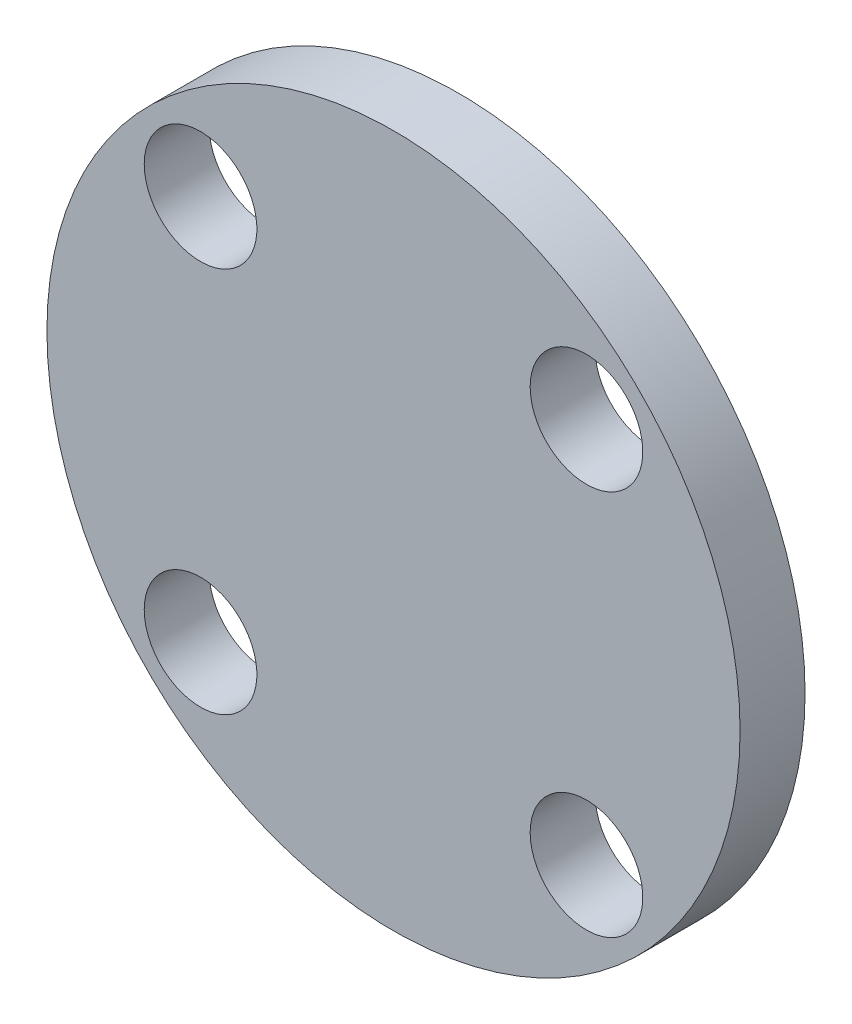
ISO-10303-21;
HEADER;
FILE_DESCRIPTION(('STEP AP214'),'2;1');
FILE_NAME('part.step','',(''),(''),'','','');
FILE_SCHEMA(('AUTOMOTIVE_DESIGN { 1 0 10303 214 1 1 1 1 }'));
ENDSEC;
DATA;
#1=APPLICATION_CONTEXT('core data for automotive mechanical design processes');
#2=APPLICATION_PROTOCOL_DEFINITION('international standard','automotive_design',2000,#1);
#3=PRODUCT_CONTEXT('',#1,'mechanical');
#4=PRODUCT('Part','Part','',(#3));
#5=PRODUCT_RELATED_PRODUCT_CATEGORY('part','',(#4));
#6=PRODUCT_DEFINITION_FORMATION('','',#4);
#7=PRODUCT_DEFINITION_CONTEXT('part definition',#1,'design');
#8=PRODUCT_DEFINITION('design','',#6,#7);
#9=PRODUCT_DEFINITION_SHAPE('','',#8);
#10=(LENGTH_UNIT() NAMED_UNIT(*) SI_UNIT(.MILLI.,.METRE.));
#11=(NAMED_UNIT(*) PLANE_ANGLE_UNIT() SI_UNIT($,.RADIAN.));
#12=(NAMED_UNIT(*) SI_UNIT($,.STERADIAN.) SOLID_ANGLE_UNIT());
#13=UNCERTAINTY_MEASURE_WITH_UNIT(LENGTH_MEASURE(1.E-05),#10,'distance_accuracy_value','');
#14=(GEOMETRIC_REPRESENTATION_CONTEXT(3) GLOBAL_UNCERTAINTY_ASSIGNED_CONTEXT((#13)) GLOBAL_UNIT_ASSIGNED_CONTEXT((#10,
#11,#12)) REPRESENTATION_CONTEXT('',''));
#15=CARTESIAN_POINT('',(0.,0.,0.));
#16=DIRECTION('',(0.,0.,1.));
#17=DIRECTION('',(1.,0.,0.));
#18=AXIS2_PLACEMENT_3D('',#15,#16,#17);
#19=CARTESIAN_POINT('',(0.,0.,9.525));
#20=DIRECTION('',(0.,0.,1.));
#21=DIRECTION('',(1.,0.,0.));
#22=AXIS2_PLACEMENT_3D('',#19,#20,#21);
#23=PLANE('',#22);
#24=CARTESIAN_POINT('',(28.28421467892,-28.2842146789189,9.525));
#25=DIRECTION('',(0.,0.,1.));
#26=DIRECTION('',(1.,0.,0.));
#27=AXIS2_PLACEMENT_3D('',#24,#25,#26);
#28=CIRCLE('',#27,8.255);
#29=CARTESIAN_POINT('',(20.02921467892,-28.2842146789189,9.525));
#30=VERTEX_POINT('',#29);
#31=EDGE_CURVE('E61',#30,#30,#28,.T.);
#32=ORIENTED_EDGE('',*,*,#31,.F.);
#33=EDGE_LOOP('',(#32));
#34=FACE_BOUND('',#33,.T.);
#35=CARTESIAN_POINT('',(-28.2842146789189,28.2842146789189,9.525));
#36=DIRECTION('',(0.,0.,1.));
#37=DIRECTION('',(1.,0.,0.));
#38=AXIS2_PLACEMENT_3D('',#35,#36,#37);
#39=CIRCLE('',#38,8.25499999999999);
#40=CARTESIAN_POINT('',(-36.5392146789189,28.2842146789189,9.525));
#41=VERTEX_POINT('',#40);
#42=EDGE_CURVE('E50',#41,#41,#39,.T.);
#43=ORIENTED_EDGE('',*,*,#42,.F.);
#44=EDGE_LOOP('',(#43));
#45=FACE_BOUND('',#44,.T.);
#46=CARTESIAN_POINT('',(0.,0.,9.525));
#47=DIRECTION('',(0.,0.,1.));
#48=DIRECTION('',(1.,0.,0.));
#49=AXIS2_PLACEMENT_3D('',#46,#47,#48);
#50=CIRCLE('',#49,50.8);
#51=CARTESIAN_POINT('',(-50.8,0.,9.525));
#52=VERTEX_POINT('',#51);
#53=EDGE_CURVE('E10',#52,#52,#50,.T.);
#54=ORIENTED_EDGE('',*,*,#53,.T.);
#55=EDGE_LOOP('',(#54));
#56=FACE_BOUND('',#55,.T.);
#57=CARTESIAN_POINT('',(28.2842146789189,28.2842146789189,9.525));
#58=DIRECTION('',(0.,0.,1.));
#59=DIRECTION('',(1.,0.,0.));
#60=AXIS2_PLACEMENT_3D('',#57,#58,#59);
#61=CIRCLE('',#60,8.25500000000001);
#62=CARTESIAN_POINT('',(20.0292146789189,28.2842146789189,9.525));
#63=VERTEX_POINT('',#62);
#64=EDGE_CURVE('E55',#63,#63,#61,.T.);
#65=ORIENTED_EDGE('',*,*,#64,.F.);
#66=EDGE_LOOP('',(#65));
#67=FACE_BOUND('',#66,.T.);
#68=CARTESIAN_POINT('',(-28.2842146789189,-28.284214678919,9.525));
#69=DIRECTION('',(0.,0.,1.));
#70=DIRECTION('',(1.,0.,0.));
#71=AXIS2_PLACEMENT_3D('',#68,#69,#70);
#72=CIRCLE('',#71,8.255);
#73=CARTESIAN_POINT('',(-36.5392146789189,-28.284214678919,9.525));
#74=VERTEX_POINT('',#73);
#75=EDGE_CURVE('E67',#74,#74,#72,.T.);
#76=ORIENTED_EDGE('',*,*,#75,.F.);
#77=EDGE_LOOP('',(#76));
#78=FACE_BOUND('',#77,.T.);
#79=ADVANCED_FACE('F39',(#34,#45,#56,#67,#78),#23,.T.);
#80=CARTESIAN_POINT('',(0.,0.,0.));
#81=DIRECTION('',(0.,0.,1.));
#82=DIRECTION('',(1.,0.,0.));
#83=AXIS2_PLACEMENT_3D('',#80,#81,#82);
#84=PLANE('',#83);
#85=CARTESIAN_POINT('',(0.,0.,0.));
#86=DIRECTION('',(0.,0.,1.));
#87=DIRECTION('',(1.,0.,0.));
#88=AXIS2_PLACEMENT_3D('',#85,#86,#87);
#89=CIRCLE('',#88,50.8);
#90=CARTESIAN_POINT('',(-50.8,0.,0.));
#91=VERTEX_POINT('',#90);
#92=EDGE_CURVE('E43',#91,#91,#89,.T.);
#93=ORIENTED_EDGE('',*,*,#92,.F.);
#94=EDGE_LOOP('',(#93));
#95=FACE_BOUND('',#94,.T.);
#96=CARTESIAN_POINT('',(-28.2842146789189,28.2842146789189,0.));
#97=DIRECTION('',(0.,0.,1.));
#98=DIRECTION('',(1.,0.,0.));
#99=AXIS2_PLACEMENT_3D('',#96,#97,#98);
#100=CIRCLE('',#99,8.25499999999999);
#101=CARTESIAN_POINT('',(-36.5392146789189,28.2842146789189,0.));
#102=VERTEX_POINT('',#101);
#103=EDGE_CURVE('E52',#102,#102,#100,.T.);
#104=ORIENTED_EDGE('',*,*,#103,.T.);
#105=EDGE_LOOP('',(#104));
#106=FACE_BOUND('',#105,.T.);
#107=CARTESIAN_POINT('',(28.2842146789189,28.2842146789189,0.));
#108=DIRECTION('',(0.,0.,1.));
#109=DIRECTION('',(1.,0.,0.));
#110=AXIS2_PLACEMENT_3D('',#107,#108,#109);
#111=CIRCLE('',#110,8.25500000000001);
#112=CARTESIAN_POINT('',(20.0292146789189,28.2842146789189,0.));
#113=VERTEX_POINT('',#112);
#114=EDGE_CURVE('E58',#113,#113,#111,.T.);
#115=ORIENTED_EDGE('',*,*,#114,.T.);
#116=EDGE_LOOP('',(#115));
#117=FACE_BOUND('',#116,.T.);
#118=CARTESIAN_POINT('',(28.28421467892,-28.2842146789189,0.));
#119=DIRECTION('',(0.,0.,1.));
#120=DIRECTION('',(1.,0.,0.));
#121=AXIS2_PLACEMENT_3D('',#118,#119,#120);
#122=CIRCLE('',#121,8.255);
#123=CARTESIAN_POINT('',(20.02921467892,-28.2842146789189,0.));
#124=VERTEX_POINT('',#123);
#125=EDGE_CURVE('E64',#124,#124,#122,.T.);
#126=ORIENTED_EDGE('',*,*,#125,.T.);
#127=EDGE_LOOP('',(#126));
#128=FACE_BOUND('',#127,.T.);
#129=CARTESIAN_POINT('',(-28.2842146789189,-28.284214678919,0.));
#130=DIRECTION('',(0.,0.,1.));
#131=DIRECTION('',(1.,0.,0.));
#132=AXIS2_PLACEMENT_3D('',#129,#130,#131);
#133=CIRCLE('',#132,8.255);
#134=CARTESIAN_POINT('',(-36.5392146789189,-28.284214678919,0.));
#135=VERTEX_POINT('',#134);
#136=EDGE_CURVE('E70',#135,#135,#133,.T.);
#137=ORIENTED_EDGE('',*,*,#136,.T.);
#138=EDGE_LOOP('',(#137));
#139=FACE_BOUND('',#138,.T.);
#140=ADVANCED_FACE('F80',(#95,#106,#117,#128,#139),#84,.F.);
#141=CARTESIAN_POINT('',(0.,0.,9.525));
#142=DIRECTION('',(0.,0.,-1.));
#143=DIRECTION('',(-1.,0.,0.));
#144=AXIS2_PLACEMENT_3D('',#141,#142,#143);
#145=CYLINDRICAL_SURFACE('',#144,50.8);
#146=CARTESIAN_POINT('',(-50.8,0.,9.525));
#147=CARTESIAN_POINT('',(-50.8,0.,9.42578125));
#148=CARTESIAN_POINT('',(-50.8,0.,9.3265625));
#149=CARTESIAN_POINT('',(-50.8,0.,9.128125));
#150=CARTESIAN_POINT('',(-50.8,0.,9.02890625));
#151=CARTESIAN_POINT('',(-50.8,0.,8.83046875));
#152=CARTESIAN_POINT('',(-50.8,0.,8.73125));
#153=CARTESIAN_POINT('',(-50.8,0.,8.5328125));
#154=CARTESIAN_POINT('',(-50.8,0.,8.43359375));
#155=CARTESIAN_POINT('',(-50.8,0.,8.23515625));
#156=CARTESIAN_POINT('',(-50.8,0.,8.1359375));
#157=CARTESIAN_POINT('',(-50.8,0.,7.9375));
#158=CARTESIAN_POINT('',(-50.8,0.,7.83828125));
#159=CARTESIAN_POINT('',(-50.8,0.,7.63984375));
#160=CARTESIAN_POINT('',(-50.8,0.,7.540625));
#161=CARTESIAN_POINT('',(-50.8,0.,7.3421875));
#162=CARTESIAN_POINT('',(-50.8,0.,7.24296875));
#163=CARTESIAN_POINT('',(-50.8,0.,7.04453125));
#164=CARTESIAN_POINT('',(-50.8,0.,6.9453125));
#165=CARTESIAN_POINT('',(-50.8,0.,6.746875));
#166=CARTESIAN_POINT('',(-50.8,0.,6.64765625));
#167=CARTESIAN_POINT('',(-50.8,0.,6.44921875));
#168=CARTESIAN_POINT('',(-50.8,0.,6.35));
#169=CARTESIAN_POINT('',(-50.8,0.,6.1515625));
#170=CARTESIAN_POINT('',(-50.8,0.,6.05234375));
#171=CARTESIAN_POINT('',(-50.8,0.,5.85390625));
#172=CARTESIAN_POINT('',(-50.8,0.,5.7546875));
#173=CARTESIAN_POINT('',(-50.8,0.,5.55625));
#174=CARTESIAN_POINT('',(-50.8,0.,5.45703125));
#175=CARTESIAN_POINT('',(-50.8,0.,5.25859375));
#176=CARTESIAN_POINT('',(-50.8,0.,5.159375));
#177=CARTESIAN_POINT('',(-50.8,0.,4.9609375));
#178=CARTESIAN_POINT('',(-50.8,0.,4.86171875));
#179=CARTESIAN_POINT('',(-50.8,0.,4.66328125));
#180=CARTESIAN_POINT('',(-50.8,0.,4.5640625));
#181=CARTESIAN_POINT('',(-50.8,0.,4.365625));
#182=CARTESIAN_POINT('',(-50.8,0.,4.26640625));
#183=CARTESIAN_POINT('',(-50.8,0.,4.06796875));
#184=CARTESIAN_POINT('',(-50.8,0.,3.96875));
#185=CARTESIAN_POINT('',(-50.8,0.,3.7703125));
#186=CARTESIAN_POINT('',(-50.8,0.,3.67109375));
#187=CARTESIAN_POINT('',(-50.8,0.,3.47265625));
#188=CARTESIAN_POINT('',(-50.8,0.,3.3734375));
#189=CARTESIAN_POINT('',(-50.8,0.,3.175));
#190=CARTESIAN_POINT('',(-50.8,0.,3.07578125));
#191=CARTESIAN_POINT('',(-50.8,0.,2.87734375));
#192=CARTESIAN_POINT('',(-50.8,0.,2.778125));
#193=CARTESIAN_POINT('',(-50.8,0.,2.5796875));
#194=CARTESIAN_POINT('',(-50.8,0.,2.48046875));
#195=CARTESIAN_POINT('',(-50.8,0.,2.28203125));
#196=CARTESIAN_POINT('',(-50.8,0.,2.1828125));
#197=CARTESIAN_POINT('',(-50.8,0.,1.984375));
#198=CARTESIAN_POINT('',(-50.8,0.,1.88515625));
#199=CARTESIAN_POINT('',(-50.8,0.,1.68671875));
#200=CARTESIAN_POINT('',(-50.8,0.,1.5875));
#201=CARTESIAN_POINT('',(-50.8,0.,1.3890625));
#202=CARTESIAN_POINT('',(-50.8,0.,1.28984375));
#203=CARTESIAN_POINT('',(-50.8,0.,1.09140625));
#204=CARTESIAN_POINT('',(-50.8,0.,0.992187500000001));
#205=CARTESIAN_POINT('',(-50.8,0.,0.793750000000001));
#206=CARTESIAN_POINT('',(-50.8,0.,0.69453125));
#207=CARTESIAN_POINT('',(-50.8,0.,0.49609375));
#208=CARTESIAN_POINT('',(-50.8,0.,0.396875));
#209=CARTESIAN_POINT('',(-50.8,0.,0.1984375));
#210=CARTESIAN_POINT('',(-50.8,0.,0.0992187500000001));
#211=CARTESIAN_POINT('',(-50.8,0.,0.));
#212=B_SPLINE_CURVE_WITH_KNOTS('',3,(#146,#147,#148,#149,#150,#151,#152,#153,#154,#155,#156,
#157,#158,#159,#160,#161,#162,#163,#164,#165,#166,#167,#168,#169,#170,#171,#172,#173,#174,#175,
#176,#177,#178,#179,#180,#181,#182,#183,#184,#185,#186,#187,#188,#189,#190,#191,#192,#193,#194,
#195,#196,#197,#198,#199,#200,#201,#202,#203,#204,#205,#206,#207,#208,#209,#210,#211),
.UNSPECIFIED.,.F.,.F.,(4,2,2,2,2,2,2,2,2,2,2,2,2,2,2,2,2,2,2,2,2,2,2,2,2,2,2,2,2,2,2,2,4),(0.,
0.297656249999998,0.595312499999999,0.892968749999999,1.190625,1.48828125,1.7859375,2.08359375,
2.38125,2.67890625,2.9765625,3.27421875,3.571875,3.86953125,4.1671875,4.46484375,4.7625,
5.06015625,5.3578125,5.65546875,5.953125,6.25078125,6.5484375,6.84609375,7.14375,7.44140625,
7.7390625,8.03671875,8.334375,8.63203125,8.9296875,9.22734375,9.525),.UNSPECIFIED.);
#213=EDGE_CURVE('BSEAM41',#52,#91,#212,.T.);
#214=ORIENTED_EDGE('',*,*,#53,.F.);
#215=ORIENTED_EDGE('',*,*,#92,.T.);
#216=ORIENTED_EDGE('',*,*,#213,.T.);
#217=ORIENTED_EDGE('',*,*,#213,.F.);
#218=EDGE_LOOP('',(#214,#216,#215,#217));
#219=FACE_BOUND('',#218,.T.);
#220=ADVANCED_FACE('F41',(#219),#145,.T.);
#221=CARTESIAN_POINT('',(-28.2842146789189,28.2842146789189,9.525));
#222=DIRECTION('',(0.,0.,-1.));
#223=DIRECTION('',(-1.,0.,0.));
#224=AXIS2_PLACEMENT_3D('',#221,#222,#223);
#225=CYLINDRICAL_SURFACE('',#224,8.25499999999999);
#226=CARTESIAN_POINT('',(-36.5392146789189,28.2842146789189,9.525));
#227=CARTESIAN_POINT('',(-36.5392146789189,28.2842146789189,9.42578125));
#228=CARTESIAN_POINT('',(-36.5392146789189,28.2842146789189,9.3265625));
#229=CARTESIAN_POINT('',(-36.5392146789189,28.2842146789189,9.128125));
#230=CARTESIAN_POINT('',(-36.5392146789189,28.2842146789189,9.02890625));
#231=CARTESIAN_POINT('',(-36.5392146789189,28.2842146789189,8.83046875));
#232=CARTESIAN_POINT('',(-36.5392146789189,28.2842146789189,8.73125));
#233=CARTESIAN_POINT('',(-36.5392146789189,28.2842146789189,8.5328125));
#234=CARTESIAN_POINT('',(-36.5392146789189,28.2842146789189,8.43359375));
#235=CARTESIAN_POINT('',(-36.5392146789189,28.2842146789189,8.23515625));
#236=CARTESIAN_POINT('',(-36.5392146789189,28.2842146789189,8.1359375));
#237=CARTESIAN_POINT('',(-36.5392146789189,28.2842146789189,7.9375));
#238=CARTESIAN_POINT('',(-36.5392146789189,28.2842146789189,7.83828125));
#239=CARTESIAN_POINT('',(-36.5392146789189,28.2842146789189,7.63984375));
#240=CARTESIAN_POINT('',(-36.5392146789189,28.2842146789189,7.540625));
#241=CARTESIAN_POINT('',(-36.5392146789189,28.2842146789189,7.3421875));
#242=CARTESIAN_POINT('',(-36.5392146789189,28.2842146789189,7.24296875));
#243=CARTESIAN_POINT('',(-36.5392146789189,28.2842146789189,7.04453125));
#244=CARTESIAN_POINT('',(-36.5392146789189,28.2842146789189,6.9453125));
#245=CARTESIAN_POINT('',(-36.5392146789189,28.2842146789189,6.746875));
#246=CARTESIAN_POINT('',(-36.5392146789189,28.2842146789189,6.64765625));
#247=CARTESIAN_POINT('',(-36.5392146789189,28.2842146789189,6.44921875));
#248=CARTESIAN_POINT('',(-36.5392146789189,28.2842146789189,6.35));
#249=CARTESIAN_POINT('',(-36.5392146789189,28.2842146789189,6.1515625));
#250=CARTESIAN_POINT('',(-36.5392146789189,28.2842146789189,6.05234375));
#251=CARTESIAN_POINT('',(-36.5392146789189,28.2842146789189,5.85390625));
#252=CARTESIAN_POINT('',(-36.5392146789189,28.2842146789189,5.7546875));
#253=CARTESIAN_POINT('',(-36.5392146789189,28.2842146789189,5.55625));
#254=CARTESIAN_POINT('',(-36.5392146789189,28.2842146789189,5.45703125));
#255=CARTESIAN_POINT('',(-36.5392146789189,28.2842146789189,5.25859375));
#256=CARTESIAN_POINT('',(-36.5392146789189,28.2842146789189,5.159375));
#257=CARTESIAN_POINT('',(-36.5392146789189,28.2842146789189,4.9609375));
#258=CARTESIAN_POINT('',(-36.5392146789189,28.2842146789189,4.86171875));
#259=CARTESIAN_POINT('',(-36.5392146789189,28.2842146789189,4.66328125));
#260=CARTESIAN_POINT('',(-36.5392146789189,28.2842146789189,4.5640625));
#261=CARTESIAN_POINT('',(-36.5392146789189,28.2842146789189,4.365625));
#262=CARTESIAN_POINT('',(-36.5392146789189,28.2842146789189,4.26640625));
#263=CARTESIAN_POINT('',(-36.5392146789189,28.2842146789189,4.06796875));
#264=CARTESIAN_POINT('',(-36.5392146789189,28.2842146789189,3.96875));
#265=CARTESIAN_POINT('',(-36.5392146789189,28.2842146789189,3.7703125));
#266=CARTESIAN_POINT('',(-36.5392146789189,28.2842146789189,3.67109375));
#267=CARTESIAN_POINT('',(-36.5392146789189,28.2842146789189,3.47265625));
#268=CARTESIAN_POINT('',(-36.5392146789189,28.2842146789189,3.3734375));
#269=CARTESIAN_POINT('',(-36.5392146789189,28.2842146789189,3.175));
#270=CARTESIAN_POINT('',(-36.5392146789189,28.2842146789189,3.07578125));
#271=CARTESIAN_POINT('',(-36.5392146789189,28.2842146789189,2.87734375));
#272=CARTESIAN_POINT('',(-36.5392146789189,28.2842146789189,2.778125));
#273=CARTESIAN_POINT('',(-36.5392146789189,28.2842146789189,2.5796875));
#274=CARTESIAN_POINT('',(-36.5392146789189,28.2842146789189,2.48046875));
#275=CARTESIAN_POINT('',(-36.5392146789189,28.2842146789189,2.28203125));
#276=CARTESIAN_POINT('',(-36.5392146789189,28.2842146789189,2.1828125));
#277=CARTESIAN_POINT('',(-36.5392146789189,28.2842146789189,1.984375));
#278=CARTESIAN_POINT('',(-36.5392146789189,28.2842146789189,1.88515625));
#279=CARTESIAN_POINT('',(-36.5392146789189,28.2842146789189,1.68671875));
#280=CARTESIAN_POINT('',(-36.5392146789189,28.2842146789189,1.5875));
#281=CARTESIAN_POINT('',(-36.5392146789189,28.2842146789189,1.3890625));
#282=CARTESIAN_POINT('',(-36.5392146789189,28.2842146789189,1.28984375));
#283=CARTESIAN_POINT('',(-36.5392146789189,28.2842146789189,1.09140625));
#284=CARTESIAN_POINT('',(-36.5392146789189,28.2842146789189,0.992187500000001));
#285=CARTESIAN_POINT('',(-36.5392146789189,28.2842146789189,0.793750000000001));
#286=CARTESIAN_POINT('',(-36.5392146789189,28.2842146789189,0.69453125));
#287=CARTESIAN_POINT('',(-36.5392146789189,28.2842146789189,0.49609375));
#288=CARTESIAN_POINT('',(-36.5392146789189,28.2842146789189,0.396875));
#289=CARTESIAN_POINT('',(-36.5392146789189,28.2842146789189,0.1984375));
#290=CARTESIAN_POINT('',(-36.5392146789189,28.2842146789189,0.0992187500000001));
#291=CARTESIAN_POINT('',(-36.5392146789189,28.2842146789189,0.));
#292=B_SPLINE_CURVE_WITH_KNOTS('',3,(#226,#227,#228,#229,#230,#231,#232,#233,#234,#235,#236,
#237,#238,#239,#240,#241,#242,#243,#244,#245,#246,#247,#248,#249,#250,#251,#252,#253,#254,#255,
#256,#257,#258,#259,#260,#261,#262,#263,#264,#265,#266,#267,#268,#269,#270,#271,#272,#273,#274,
#275,#276,#277,#278,#279,#280,#281,#282,#283,#284,#285,#286,#287,#288,#289,#290,#291),
.UNSPECIFIED.,.F.,.F.,(4,2,2,2,2,2,2,2,2,2,2,2,2,2,2,2,2,2,2,2,2,2,2,2,2,2,2,2,2,2,2,2,4),(0.,
0.297656249999998,0.595312499999999,0.892968749999999,1.190625,1.48828125,1.7859375,2.08359375,
2.38125,2.67890625,2.9765625,3.27421875,3.571875,3.86953125,4.1671875,4.46484375,4.7625,
5.06015625,5.3578125,5.65546875,5.953125,6.25078125,6.5484375,6.84609375,7.14375,7.44140625,
7.7390625,8.03671875,8.334375,8.63203125,8.9296875,9.22734375,9.525),.UNSPECIFIED.);
#293=EDGE_CURVE('BSEAM90',#41,#102,#292,.T.);
#294=ORIENTED_EDGE('',*,*,#42,.T.);
#295=ORIENTED_EDGE('',*,*,#103,.F.);
#296=ORIENTED_EDGE('',*,*,#293,.T.);
#297=ORIENTED_EDGE('',*,*,#293,.F.);
#298=EDGE_LOOP('',(#294,#296,#295,#297));
#299=FACE_BOUND('',#298,.T.);
#300=ADVANCED_FACE('F90',(#299),#225,.F.);
#301=CARTESIAN_POINT('',(28.2842146789189,28.2842146789189,9.525));
#302=DIRECTION('',(0.,0.,-1.));
#303=DIRECTION('',(-1.,0.,0.));
#304=AXIS2_PLACEMENT_3D('',#301,#302,#303);
#305=CYLINDRICAL_SURFACE('',#304,8.25500000000001);
#306=CARTESIAN_POINT('',(20.0292146789189,28.2842146789189,9.525));
#307=CARTESIAN_POINT('',(20.0292146789189,28.2842146789189,9.42578125));
#308=CARTESIAN_POINT('',(20.0292146789189,28.2842146789189,9.3265625));
#309=CARTESIAN_POINT('',(20.0292146789189,28.2842146789189,9.128125));
#310=CARTESIAN_POINT('',(20.0292146789189,28.2842146789189,9.02890625));
#311=CARTESIAN_POINT('',(20.0292146789189,28.2842146789189,8.83046875));
#312=CARTESIAN_POINT('',(20.0292146789189,28.2842146789189,8.73125));
#313=CARTESIAN_POINT('',(20.0292146789189,28.2842146789189,8.5328125));
#314=CARTESIAN_POINT('',(20.0292146789189,28.2842146789189,8.43359375));
#315=CARTESIAN_POINT('',(20.0292146789189,28.2842146789189,8.23515625));
#316=CARTESIAN_POINT('',(20.0292146789189,28.2842146789189,8.1359375));
#317=CARTESIAN_POINT('',(20.0292146789189,28.2842146789189,7.9375));
#318=CARTESIAN_POINT('',(20.0292146789189,28.2842146789189,7.83828125));
#319=CARTESIAN_POINT('',(20.0292146789189,28.2842146789189,7.63984375));
#320=CARTESIAN_POINT('',(20.0292146789189,28.2842146789189,7.540625));
#321=CARTESIAN_POINT('',(20.0292146789189,28.2842146789189,7.3421875));
#322=CARTESIAN_POINT('',(20.0292146789189,28.2842146789189,7.24296875));
#323=CARTESIAN_POINT('',(20.0292146789189,28.2842146789189,7.04453125));
#324=CARTESIAN_POINT('',(20.0292146789189,28.2842146789189,6.9453125));
#325=CARTESIAN_POINT('',(20.0292146789189,28.2842146789189,6.746875));
#326=CARTESIAN_POINT('',(20.0292146789189,28.2842146789189,6.64765625));
#327=CARTESIAN_POINT('',(20.0292146789189,28.2842146789189,6.44921875));
#328=CARTESIAN_POINT('',(20.0292146789189,28.2842146789189,6.35));
#329=CARTESIAN_POINT('',(20.0292146789189,28.2842146789189,6.1515625));
#330=CARTESIAN_POINT('',(20.0292146789189,28.2842146789189,6.05234375));
#331=CARTESIAN_POINT('',(20.0292146789189,28.2842146789189,5.85390625));
#332=CARTESIAN_POINT('',(20.0292146789189,28.2842146789189,5.7546875));
#333=CARTESIAN_POINT('',(20.0292146789189,28.2842146789189,5.55625));
#334=CARTESIAN_POINT('',(20.0292146789189,28.2842146789189,5.45703125));
#335=CARTESIAN_POINT('',(20.0292146789189,28.2842146789189,5.25859375));
#336=CARTESIAN_POINT('',(20.0292146789189,28.2842146789189,5.159375));
#337=CARTESIAN_POINT('',(20.0292146789189,28.2842146789189,4.9609375));
#338=CARTESIAN_POINT('',(20.0292146789189,28.2842146789189,4.86171875));
#339=CARTESIAN_POINT('',(20.0292146789189,28.2842146789189,4.66328125));
#340=CARTESIAN_POINT('',(20.0292146789189,28.2842146789189,4.5640625));
#341=CARTESIAN_POINT('',(20.0292146789189,28.2842146789189,4.365625));
#342=CARTESIAN_POINT('',(20.0292146789189,28.2842146789189,4.26640625));
#343=CARTESIAN_POINT('',(20.0292146789189,28.2842146789189,4.06796875));
#344=CARTESIAN_POINT('',(20.0292146789189,28.2842146789189,3.96875));
#345=CARTESIAN_POINT('',(20.0292146789189,28.2842146789189,3.7703125));
#346=CARTESIAN_POINT('',(20.0292146789189,28.2842146789189,3.67109375));
#347=CARTESIAN_POINT('',(20.0292146789189,28.2842146789189,3.47265625));
#348=CARTESIAN_POINT('',(20.0292146789189,28.2842146789189,3.3734375));
#349=CARTESIAN_POINT('',(20.0292146789189,28.2842146789189,3.175));
#350=CARTESIAN_POINT('',(20.0292146789189,28.2842146789189,3.07578125));
#351=CARTESIAN_POINT('',(20.0292146789189,28.2842146789189,2.87734375));
#352=CARTESIAN_POINT('',(20.0292146789189,28.2842146789189,2.778125));
#353=CARTESIAN_POINT('',(20.0292146789189,28.2842146789189,2.5796875));
#354=CARTESIAN_POINT('',(20.0292146789189,28.2842146789189,2.48046875));
#355=CARTESIAN_POINT('',(20.0292146789189,28.2842146789189,2.28203125));
#356=CARTESIAN_POINT('',(20.0292146789189,28.2842146789189,2.1828125));
#357=CARTESIAN_POINT('',(20.0292146789189,28.2842146789189,1.984375));
#358=CARTESIAN_POINT('',(20.0292146789189,28.2842146789189,1.88515625));
#359=CARTESIAN_POINT('',(20.0292146789189,28.2842146789189,1.68671875));
#360=CARTESIAN_POINT('',(20.0292146789189,28.2842146789189,1.5875));
#361=CARTESIAN_POINT('',(20.0292146789189,28.2842146789189,1.3890625));
#362=CARTESIAN_POINT('',(20.0292146789189,28.2842146789189,1.28984375));
#363=CARTESIAN_POINT('',(20.0292146789189,28.2842146789189,1.09140625));
#364=CARTESIAN_POINT('',(20.0292146789189,28.2842146789189,0.992187500000001));
#365=CARTESIAN_POINT('',(20.0292146789189,28.2842146789189,0.793750000000001));
#366=CARTESIAN_POINT('',(20.0292146789189,28.2842146789189,0.69453125));
#367=CARTESIAN_POINT('',(20.0292146789189,28.2842146789189,0.49609375));
#368=CARTESIAN_POINT('',(20.0292146789189,28.2842146789189,0.396875));
#369=CARTESIAN_POINT('',(20.0292146789189,28.2842146789189,0.1984375));
#370=CARTESIAN_POINT('',(20.0292146789189,28.2842146789189,0.0992187500000001));
#371=CARTESIAN_POINT('',(20.0292146789189,28.2842146789189,0.));
#372=B_SPLINE_CURVE_WITH_KNOTS('',3,(#306,#307,#308,#309,#310,#311,#312,#313,#314,#315,#316,
#317,#318,#319,#320,#321,#322,#323,#324,#325,#326,#327,#328,#329,#330,#331,#332,#333,#334,#335,
#336,#337,#338,#339,#340,#341,#342,#343,#344,#345,#346,#347,#348,#349,#350,#351,#352,#353,#354,
#355,#356,#357,#358,#359,#360,#361,#362,#363,#364,#365,#366,#367,#368,#369,#370,#371),
.UNSPECIFIED.,.F.,.F.,(4,2,2,2,2,2,2,2,2,2,2,2,2,2,2,2,2,2,2,2,2,2,2,2,2,2,2,2,2,2,2,2,4),(0.,
0.297656249999998,0.595312499999999,0.892968749999999,1.190625,1.48828125,1.7859375,2.08359375,
2.38125,2.67890625,2.9765625,3.27421875,3.571875,3.86953125,4.1671875,4.46484375,4.7625,
5.06015625,5.3578125,5.65546875,5.953125,6.25078125,6.5484375,6.84609375,7.14375,7.44140625,
7.7390625,8.03671875,8.334375,8.63203125,8.9296875,9.22734375,9.525),.UNSPECIFIED.);
#373=EDGE_CURVE('BSEAM93',#63,#113,#372,.T.);
#374=ORIENTED_EDGE('',*,*,#64,.T.);
#375=ORIENTED_EDGE('',*,*,#114,.F.);
#376=ORIENTED_EDGE('',*,*,#373,.T.);
#377=ORIENTED_EDGE('',*,*,#373,.F.);
#378=EDGE_LOOP('',(#374,#376,#375,#377));
#379=FACE_BOUND('',#378,.T.);
#380=ADVANCED_FACE('F93',(#379),#305,.F.);
#381=CARTESIAN_POINT('',(28.28421467892,-28.2842146789189,9.525));
#382=DIRECTION('',(0.,0.,-1.));
#383=DIRECTION('',(-1.,0.,0.));
#384=AXIS2_PLACEMENT_3D('',#381,#382,#383);
#385=CYLINDRICAL_SURFACE('',#384,8.255);
#386=CARTESIAN_POINT('',(20.02921467892,-28.2842146789189,9.525));
#387=CARTESIAN_POINT('',(20.02921467892,-28.2842146789189,9.42578125));
#388=CARTESIAN_POINT('',(20.02921467892,-28.2842146789189,9.3265625));
#389=CARTESIAN_POINT('',(20.02921467892,-28.2842146789189,9.128125));
#390=CARTESIAN_POINT('',(20.02921467892,-28.2842146789189,9.02890625));
#391=CARTESIAN_POINT('',(20.02921467892,-28.2842146789189,8.83046875));
#392=CARTESIAN_POINT('',(20.02921467892,-28.2842146789189,8.73125));
#393=CARTESIAN_POINT('',(20.02921467892,-28.2842146789189,8.5328125));
#394=CARTESIAN_POINT('',(20.02921467892,-28.2842146789189,8.43359375));
#395=CARTESIAN_POINT('',(20.02921467892,-28.2842146789189,8.23515625));
#396=CARTESIAN_POINT('',(20.02921467892,-28.2842146789189,8.1359375));
#397=CARTESIAN_POINT('',(20.02921467892,-28.2842146789189,7.9375));
#398=CARTESIAN_POINT('',(20.02921467892,-28.2842146789189,7.83828125));
#399=CARTESIAN_POINT('',(20.02921467892,-28.2842146789189,7.63984375));
#400=CARTESIAN_POINT('',(20.02921467892,-28.2842146789189,7.540625));
#401=CARTESIAN_POINT('',(20.02921467892,-28.2842146789189,7.3421875));
#402=CARTESIAN_POINT('',(20.02921467892,-28.2842146789189,7.24296875));
#403=CARTESIAN_POINT('',(20.02921467892,-28.2842146789189,7.04453125));
#404=CARTESIAN_POINT('',(20.02921467892,-28.2842146789189,6.9453125));
#405=CARTESIAN_POINT('',(20.02921467892,-28.2842146789189,6.746875));
#406=CARTESIAN_POINT('',(20.02921467892,-28.2842146789189,6.64765625));
#407=CARTESIAN_POINT('',(20.02921467892,-28.2842146789189,6.44921875));
#408=CARTESIAN_POINT('',(20.02921467892,-28.2842146789189,6.35));
#409=CARTESIAN_POINT('',(20.02921467892,-28.2842146789189,6.1515625));
#410=CARTESIAN_POINT('',(20.02921467892,-28.2842146789189,6.05234375));
#411=CARTESIAN_POINT('',(20.02921467892,-28.2842146789189,5.85390625));
#412=CARTESIAN_POINT('',(20.02921467892,-28.2842146789189,5.7546875));
#413=CARTESIAN_POINT('',(20.02921467892,-28.2842146789189,5.55625));
#414=CARTESIAN_POINT('',(20.02921467892,-28.2842146789189,5.45703125));
#415=CARTESIAN_POINT('',(20.02921467892,-28.2842146789189,5.25859375));
#416=CARTESIAN_POINT('',(20.02921467892,-28.2842146789189,5.159375));
#417=CARTESIAN_POINT('',(20.02921467892,-28.2842146789189,4.9609375));
#418=CARTESIAN_POINT('',(20.02921467892,-28.2842146789189,4.86171875));
#419=CARTESIAN_POINT('',(20.02921467892,-28.2842146789189,4.66328125));
#420=CARTESIAN_POINT('',(20.02921467892,-28.2842146789189,4.5640625));
#421=CARTESIAN_POINT('',(20.02921467892,-28.2842146789189,4.365625));
#422=CARTESIAN_POINT('',(20.02921467892,-28.2842146789189,4.26640625));
#423=CARTESIAN_POINT('',(20.02921467892,-28.2842146789189,4.06796875));
#424=CARTESIAN_POINT('',(20.02921467892,-28.2842146789189,3.96875));
#425=CARTESIAN_POINT('',(20.02921467892,-28.2842146789189,3.7703125));
#426=CARTESIAN_POINT('',(20.02921467892,-28.2842146789189,3.67109375));
#427=CARTESIAN_POINT('',(20.02921467892,-28.2842146789189,3.47265625));
#428=CARTESIAN_POINT('',(20.02921467892,-28.2842146789189,3.3734375));
#429=CARTESIAN_POINT('',(20.02921467892,-28.2842146789189,3.175));
#430=CARTESIAN_POINT('',(20.02921467892,-28.2842146789189,3.07578125));
#431=CARTESIAN_POINT('',(20.02921467892,-28.2842146789189,2.87734375));
#432=CARTESIAN_POINT('',(20.02921467892,-28.2842146789189,2.778125));
#433=CARTESIAN_POINT('',(20.02921467892,-28.2842146789189,2.5796875));
#434=CARTESIAN_POINT('',(20.02921467892,-28.2842146789189,2.48046875));
#435=CARTESIAN_POINT('',(20.02921467892,-28.2842146789189,2.28203125));
#436=CARTESIAN_POINT('',(20.02921467892,-28.2842146789189,2.1828125));
#437=CARTESIAN_POINT('',(20.02921467892,-28.2842146789189,1.984375));
#438=CARTESIAN_POINT('',(20.02921467892,-28.2842146789189,1.88515625));
#439=CARTESIAN_POINT('',(20.02921467892,-28.2842146789189,1.68671875));
#440=CARTESIAN_POINT('',(20.02921467892,-28.2842146789189,1.5875));
#441=CARTESIAN_POINT('',(20.02921467892,-28.2842146789189,1.3890625));
#442=CARTESIAN_POINT('',(20.02921467892,-28.2842146789189,1.28984375));
#443=CARTESIAN_POINT('',(20.02921467892,-28.2842146789189,1.09140625));
#444=CARTESIAN_POINT('',(20.02921467892,-28.2842146789189,0.992187500000001));
#445=CARTESIAN_POINT('',(20.02921467892,-28.2842146789189,0.793750000000001));
#446=CARTESIAN_POINT('',(20.02921467892,-28.2842146789189,0.69453125));
#447=CARTESIAN_POINT('',(20.02921467892,-28.2842146789189,0.49609375));
#448=CARTESIAN_POINT('',(20.02921467892,-28.2842146789189,0.396875));
#449=CARTESIAN_POINT('',(20.02921467892,-28.2842146789189,0.1984375));
#450=CARTESIAN_POINT('',(20.02921467892,-28.2842146789189,0.0992187500000001));
#451=CARTESIAN_POINT('',(20.02921467892,-28.2842146789189,0.));
#452=B_SPLINE_CURVE_WITH_KNOTS('',3,(#386,#387,#388,#389,#390,#391,#392,#393,#394,#395,#396,
#397,#398,#399,#400,#401,#402,#403,#404,#405,#406,#407,#408,#409,#410,#411,#412,#413,#414,#415,
#416,#417,#418,#419,#420,#421,#422,#423,#424,#425,#426,#427,#428,#429,#430,#431,#432,#433,#434,
#435,#436,#437,#438,#439,#440,#441,#442,#443,#444,#445,#446,#447,#448,#449,#450,#451),
.UNSPECIFIED.,.F.,.F.,(4,2,2,2,2,2,2,2,2,2,2,2,2,2,2,2,2,2,2,2,2,2,2,2,2,2,2,2,2,2,2,2,4),(0.,
0.297656249999998,0.595312499999999,0.892968749999999,1.190625,1.48828125,1.7859375,2.08359375,
2.38125,2.67890625,2.9765625,3.27421875,3.571875,3.86953125,4.1671875,4.46484375,4.7625,
5.06015625,5.3578125,5.65546875,5.953125,6.25078125,6.5484375,6.84609375,7.14375,7.44140625,
7.7390625,8.03671875,8.334375,8.63203125,8.9296875,9.22734375,9.525),.UNSPECIFIED.);
#453=EDGE_CURVE('BSEAM97',#30,#124,#452,.T.);
#454=ORIENTED_EDGE('',*,*,#31,.T.);
#455=ORIENTED_EDGE('',*,*,#125,.F.);
#456=ORIENTED_EDGE('',*,*,#453,.T.);
#457=ORIENTED_EDGE('',*,*,#453,.F.);
#458=EDGE_LOOP('',(#454,#456,#455,#457));
#459=FACE_BOUND('',#458,.T.);
#460=ADVANCED_FACE('F97',(#459),#385,.F.);
#461=CARTESIAN_POINT('',(-28.2842146789189,-28.284214678919,9.525));
#462=DIRECTION('',(0.,0.,-1.));
#463=DIRECTION('',(-1.,0.,0.));
#464=AXIS2_PLACEMENT_3D('',#461,#462,#463);
#465=CYLINDRICAL_SURFACE('',#464,8.255);
#466=CARTESIAN_POINT('',(-36.5392146789189,-28.284214678919,9.525));
#467=CARTESIAN_POINT('',(-36.5392146789189,-28.284214678919,9.42578125));
#468=CARTESIAN_POINT('',(-36.5392146789189,-28.284214678919,9.3265625));
#469=CARTESIAN_POINT('',(-36.5392146789189,-28.284214678919,9.128125));
#470=CARTESIAN_POINT('',(-36.5392146789189,-28.284214678919,9.02890625));
#471=CARTESIAN_POINT('',(-36.5392146789189,-28.284214678919,8.83046875));
#472=CARTESIAN_POINT('',(-36.5392146789189,-28.284214678919,8.73125));
#473=CARTESIAN_POINT('',(-36.5392146789189,-28.284214678919,8.5328125));
#474=CARTESIAN_POINT('',(-36.5392146789189,-28.284214678919,8.43359375));
#475=CARTESIAN_POINT('',(-36.5392146789189,-28.284214678919,8.23515625));
#476=CARTESIAN_POINT('',(-36.5392146789189,-28.284214678919,8.1359375));
#477=CARTESIAN_POINT('',(-36.5392146789189,-28.284214678919,7.9375));
#478=CARTESIAN_POINT('',(-36.5392146789189,-28.284214678919,7.83828125));
#479=CARTESIAN_POINT('',(-36.5392146789189,-28.284214678919,7.63984375));
#480=CARTESIAN_POINT('',(-36.5392146789189,-28.284214678919,7.540625));
#481=CARTESIAN_POINT('',(-36.5392146789189,-28.284214678919,7.3421875));
#482=CARTESIAN_POINT('',(-36.5392146789189,-28.284214678919,7.24296875));
#483=CARTESIAN_POINT('',(-36.5392146789189,-28.284214678919,7.04453125));
#484=CARTESIAN_POINT('',(-36.5392146789189,-28.284214678919,6.9453125));
#485=CARTESIAN_POINT('',(-36.5392146789189,-28.284214678919,6.746875));
#486=CARTESIAN_POINT('',(-36.5392146789189,-28.284214678919,6.64765625));
#487=CARTESIAN_POINT('',(-36.5392146789189,-28.284214678919,6.44921875));
#488=CARTESIAN_POINT('',(-36.5392146789189,-28.284214678919,6.35));
#489=CARTESIAN_POINT('',(-36.5392146789189,-28.284214678919,6.1515625));
#490=CARTESIAN_POINT('',(-36.5392146789189,-28.284214678919,6.05234375));
#491=CARTESIAN_POINT('',(-36.5392146789189,-28.284214678919,5.85390625));
#492=CARTESIAN_POINT('',(-36.5392146789189,-28.284214678919,5.7546875));
#493=CARTESIAN_POINT('',(-36.5392146789189,-28.284214678919,5.55625));
#494=CARTESIAN_POINT('',(-36.5392146789189,-28.284214678919,5.45703125));
#495=CARTESIAN_POINT('',(-36.5392146789189,-28.284214678919,5.25859375));
#496=CARTESIAN_POINT('',(-36.5392146789189,-28.284214678919,5.159375));
#497=CARTESIAN_POINT('',(-36.5392146789189,-28.284214678919,4.9609375));
#498=CARTESIAN_POINT('',(-36.5392146789189,-28.284214678919,4.86171875));
#499=CARTESIAN_POINT('',(-36.5392146789189,-28.284214678919,4.66328125));
#500=CARTESIAN_POINT('',(-36.5392146789189,-28.284214678919,4.5640625));
#501=CARTESIAN_POINT('',(-36.5392146789189,-28.284214678919,4.365625));
#502=CARTESIAN_POINT('',(-36.5392146789189,-28.284214678919,4.26640625));
#503=CARTESIAN_POINT('',(-36.5392146789189,-28.284214678919,4.06796875));
#504=CARTESIAN_POINT('',(-36.5392146789189,-28.284214678919,3.96875));
#505=CARTESIAN_POINT('',(-36.5392146789189,-28.284214678919,3.7703125));
#506=CARTESIAN_POINT('',(-36.5392146789189,-28.284214678919,3.67109375));
#507=CARTESIAN_POINT('',(-36.5392146789189,-28.284214678919,3.47265625));
#508=CARTESIAN_POINT('',(-36.5392146789189,-28.284214678919,3.3734375));
#509=CARTESIAN_POINT('',(-36.5392146789189,-28.284214678919,3.175));
#510=CARTESIAN_POINT('',(-36.5392146789189,-28.284214678919,3.07578125));
#511=CARTESIAN_POINT('',(-36.5392146789189,-28.284214678919,2.87734375));
#512=CARTESIAN_POINT('',(-36.5392146789189,-28.284214678919,2.778125));
#513=CARTESIAN_POINT('',(-36.5392146789189,-28.284214678919,2.5796875));
#514=CARTESIAN_POINT('',(-36.5392146789189,-28.284214678919,2.48046875));
#515=CARTESIAN_POINT('',(-36.5392146789189,-28.284214678919,2.28203125));
#516=CARTESIAN_POINT('',(-36.5392146789189,-28.284214678919,2.1828125));
#517=CARTESIAN_POINT('',(-36.5392146789189,-28.284214678919,1.984375));
#518=CARTESIAN_POINT('',(-36.5392146789189,-28.284214678919,1.88515625));
#519=CARTESIAN_POINT('',(-36.5392146789189,-28.284214678919,1.68671875));
#520=CARTESIAN_POINT('',(-36.5392146789189,-28.284214678919,1.5875));
#521=CARTESIAN_POINT('',(-36.5392146789189,-28.284214678919,1.3890625));
#522=CARTESIAN_POINT('',(-36.5392146789189,-28.284214678919,1.28984375));
#523=CARTESIAN_POINT('',(-36.5392146789189,-28.284214678919,1.09140625));
#524=CARTESIAN_POINT('',(-36.5392146789189,-28.284214678919,0.992187500000001));
#525=CARTESIAN_POINT('',(-36.5392146789189,-28.284214678919,0.793750000000001));
#526=CARTESIAN_POINT('',(-36.5392146789189,-28.284214678919,0.69453125));
#527=CARTESIAN_POINT('',(-36.5392146789189,-28.284214678919,0.49609375));
#528=CARTESIAN_POINT('',(-36.5392146789189,-28.284214678919,0.396875));
#529=CARTESIAN_POINT('',(-36.5392146789189,-28.284214678919,0.1984375));
#530=CARTESIAN_POINT('',(-36.5392146789189,-28.284214678919,0.0992187500000001));
#531=CARTESIAN_POINT('',(-36.5392146789189,-28.284214678919,0.));
#532=B_SPLINE_CURVE_WITH_KNOTS('',3,(#466,#467,#468,#469,#470,#471,#472,#473,#474,#475,#476,
#477,#478,#479,#480,#481,#482,#483,#484,#485,#486,#487,#488,#489,#490,#491,#492,#493,#494,#495,
#496,#497,#498,#499,#500,#501,#502,#503,#504,#505,#506,#507,#508,#509,#510,#511,#512,#513,#514,
#515,#516,#517,#518,#519,#520,#521,#522,#523,#524,#525,#526,#527,#528,#529,#530,#531),
.UNSPECIFIED.,.F.,.F.,(4,2,2,2,2,2,2,2,2,2,2,2,2,2,2,2,2,2,2,2,2,2,2,2,2,2,2,2,2,2,2,2,4),(0.,
0.297656249999998,0.595312499999999,0.892968749999999,1.190625,1.48828125,1.7859375,2.08359375,
2.38125,2.67890625,2.9765625,3.27421875,3.571875,3.86953125,4.1671875,4.46484375,4.7625,
5.06015625,5.3578125,5.65546875,5.953125,6.25078125,6.5484375,6.84609375,7.14375,7.44140625,
7.7390625,8.03671875,8.334375,8.63203125,8.9296875,9.22734375,9.525),.UNSPECIFIED.);
#533=EDGE_CURVE('BSEAM76',#74,#135,#532,.T.);
#534=ORIENTED_EDGE('',*,*,#75,.T.);
#535=ORIENTED_EDGE('',*,*,#136,.F.);
#536=ORIENTED_EDGE('',*,*,#533,.T.);
#537=ORIENTED_EDGE('',*,*,#533,.F.);
#538=EDGE_LOOP('',(#534,#536,#535,#537));
#539=FACE_BOUND('',#538,.T.);
#540=ADVANCED_FACE('F76',(#539),#465,.F.);
#541=CLOSED_SHELL('',(#79,#140,#220,#300,#380,#460,#540));
#542=MANIFOLD_SOLID_BREP('B2',#541);
#543=ADVANCED_BREP_SHAPE_REPRESENTATION('',(#18,#542),#14);
#544=SHAPE_DEFINITION_REPRESENTATION(#9,#543);
ENDSEC;
END-ISO-10303-21;
